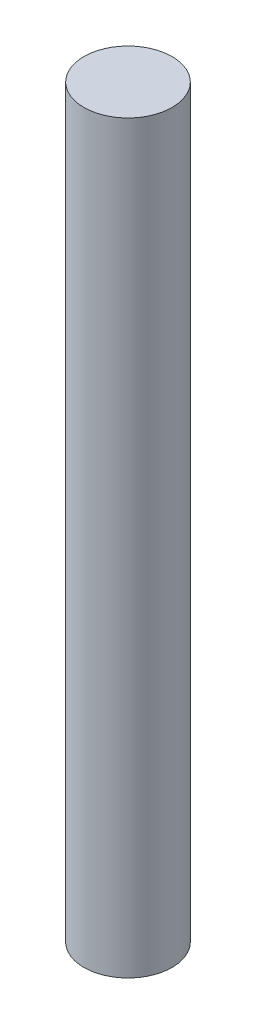
ISO-10303-21;
HEADER;
FILE_DESCRIPTION(('STEP AP214'),'2;1');
FILE_NAME('part.step','',(''),(''),'','','');
FILE_SCHEMA(('AUTOMOTIVE_DESIGN { 1 0 10303 214 1 1 1 1 }'));
ENDSEC;
DATA;
#1=APPLICATION_CONTEXT('core data for automotive mechanical design processes');
#2=APPLICATION_PROTOCOL_DEFINITION('international standard','automotive_design',2000,#1);
#3=PRODUCT_CONTEXT('',#1,'mechanical');
#4=PRODUCT('Part','Part','',(#3));
#5=PRODUCT_RELATED_PRODUCT_CATEGORY('part','',(#4));
#6=PRODUCT_DEFINITION_FORMATION('','',#4);
#7=PRODUCT_DEFINITION_CONTEXT('part definition',#1,'design');
#8=PRODUCT_DEFINITION('design','',#6,#7);
#9=PRODUCT_DEFINITION_SHAPE('','',#8);
#10=(LENGTH_UNIT() NAMED_UNIT(*) SI_UNIT(.MILLI.,.METRE.));
#11=(NAMED_UNIT(*) PLANE_ANGLE_UNIT() SI_UNIT($,.RADIAN.));
#12=(NAMED_UNIT(*) SI_UNIT($,.STERADIAN.) SOLID_ANGLE_UNIT());
#13=UNCERTAINTY_MEASURE_WITH_UNIT(LENGTH_MEASURE(1.E-05),#10,'distance_accuracy_value','');
#14=(GEOMETRIC_REPRESENTATION_CONTEXT(3) GLOBAL_UNCERTAINTY_ASSIGNED_CONTEXT((#13)) GLOBAL_UNIT_ASSIGNED_CONTEXT((#10,
#11,#12)) REPRESENTATION_CONTEXT('',''));
#15=CARTESIAN_POINT('',(0.,0.,0.));
#16=DIRECTION('',(0.,0.,1.));
#17=DIRECTION('',(1.,0.,0.));
#18=AXIS2_PLACEMENT_3D('',#15,#16,#17);
#19=CARTESIAN_POINT('',(0.,250.,0.));
#20=DIRECTION('',(0.,-1.,0.));
#21=DIRECTION('',(0.,0.,-1.));
#22=AXIS2_PLACEMENT_3D('',#19,#20,#21);
#23=CYLINDRICAL_SURFACE('',#22,14.8);
#24=CARTESIAN_POINT('',(0.,250.,0.));
#25=DIRECTION('',(0.,1.,0.));
#26=DIRECTION('',(0.,0.,1.));
#27=AXIS2_PLACEMENT_3D('',#24,#25,#26);
#28=CIRCLE('',#27,14.8);
#29=CARTESIAN_POINT('',(0.,250.,14.8));
#30=VERTEX_POINT('',#29);
#31=EDGE_CURVE('E10',#30,#30,#28,.T.);
#32=ORIENTED_EDGE('',*,*,#31,.F.);
#33=EDGE_LOOP('',(#32));
#34=FACE_BOUND('',#33,.T.);
#35=CARTESIAN_POINT('',(0.,0.,0.));
#36=DIRECTION('',(0.,1.,0.));
#37=DIRECTION('',(0.,0.,1.));
#38=AXIS2_PLACEMENT_3D('',#35,#36,#37);
#39=CIRCLE('',#38,14.8);
#40=CARTESIAN_POINT('',(0.,0.,14.8));
#41=VERTEX_POINT('',#40);
#42=EDGE_CURVE('E40',#41,#41,#39,.T.);
#43=ORIENTED_EDGE('',*,*,#42,.T.);
#44=EDGE_LOOP('',(#43));
#45=FACE_BOUND('',#44,.T.);
#46=ADVANCED_FACE('F37',(#34,#45),#23,.T.);
#47=CARTESIAN_POINT('',(0.,250.,0.));
#48=DIRECTION('',(0.,1.,0.));
#49=DIRECTION('',(0.,0.,1.));
#50=AXIS2_PLACEMENT_3D('',#47,#48,#49);
#51=PLANE('',#50);
#52=ORIENTED_EDGE('',*,*,#31,.T.);
#53=EDGE_LOOP('',(#52));
#54=FACE_BOUND('',#53,.T.);
#55=ADVANCED_FACE('F52',(#54),#51,.T.);
#56=CARTESIAN_POINT('',(0.,0.,0.));
#57=DIRECTION('',(0.,1.,0.));
#58=DIRECTION('',(0.,0.,1.));
#59=AXIS2_PLACEMENT_3D('',#56,#57,#58);
#60=PLANE('',#59);
#61=ORIENTED_EDGE('',*,*,#42,.F.);
#62=EDGE_LOOP('',(#61));
#63=FACE_BOUND('',#62,.T.);
#64=ADVANCED_FACE('F50',(#63),#60,.F.);
#65=CLOSED_SHELL('',(#46,#55,#64));
#66=MANIFOLD_SOLID_BREP('B2',#65);
#67=ADVANCED_BREP_SHAPE_REPRESENTATION('',(#18,#66),#14);
#68=SHAPE_DEFINITION_REPRESENTATION(#9,#67);
ENDSEC;
END-ISO-10303-21;
